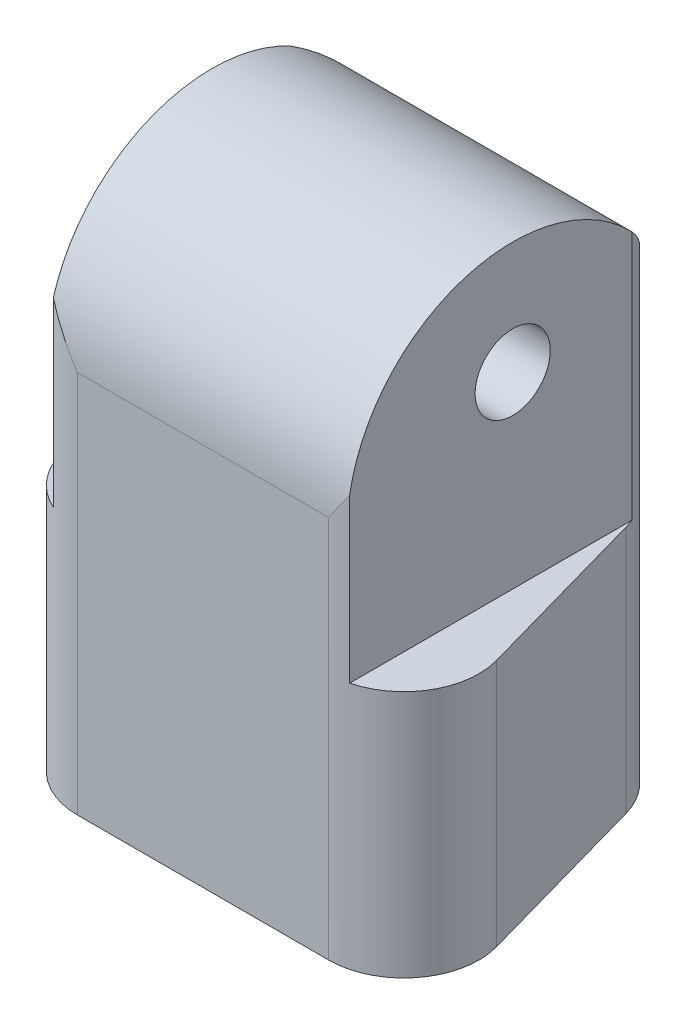
ISO-10303-21;
HEADER;
FILE_DESCRIPTION(('STEP AP214'),'2;1');
FILE_NAME('part.step','',(''),(''),'','','');
FILE_SCHEMA(('AUTOMOTIVE_DESIGN { 1 0 10303 214 1 1 1 1 }'));
ENDSEC;
DATA;
#1=APPLICATION_CONTEXT('core data for automotive mechanical design processes');
#2=APPLICATION_PROTOCOL_DEFINITION('international standard','automotive_design',2000,#1);
#3=PRODUCT_CONTEXT('',#1,'mechanical');
#4=PRODUCT('Part','Part','',(#3));
#5=PRODUCT_RELATED_PRODUCT_CATEGORY('part','',(#4));
#6=PRODUCT_DEFINITION_FORMATION('','',#4);
#7=PRODUCT_DEFINITION_CONTEXT('part definition',#1,'design');
#8=PRODUCT_DEFINITION('design','',#6,#7);
#9=PRODUCT_DEFINITION_SHAPE('','',#8);
#10=(LENGTH_UNIT() NAMED_UNIT(*) SI_UNIT(.MILLI.,.METRE.));
#11=(NAMED_UNIT(*) PLANE_ANGLE_UNIT() SI_UNIT($,.RADIAN.));
#12=(NAMED_UNIT(*) SI_UNIT($,.STERADIAN.) SOLID_ANGLE_UNIT());
#13=UNCERTAINTY_MEASURE_WITH_UNIT(LENGTH_MEASURE(1.E-05),#10,'distance_accuracy_value','');
#14=(GEOMETRIC_REPRESENTATION_CONTEXT(3) GLOBAL_UNCERTAINTY_ASSIGNED_CONTEXT((#13)) GLOBAL_UNIT_ASSIGNED_CONTEXT((#10,
#11,#12)) REPRESENTATION_CONTEXT('',''));
#15=CARTESIAN_POINT('',(0.,0.,0.));
#16=DIRECTION('',(0.,0.,1.));
#17=DIRECTION('',(1.,0.,0.));
#18=AXIS2_PLACEMENT_3D('',#15,#16,#17);
#19=CARTESIAN_POINT('',(-9.79815843344516,15.5,-7.35372788459142));
#20=DIRECTION('',(0.962650940153899,0.,0.270745576918284));
#21=DIRECTION('',(0.270745576918284,0.,-0.962650940153899));
#22=AXIS2_PLACEMENT_3D('',#19,#20,#21);
#23=PLANE('',#22);
#24=DIRECTION('',(0.,1.,0.));
#25=VECTOR('',#24,1.);
#26=CARTESIAN_POINT('',(-10.4,15.5,-5.21384675906311));
#27=LINE('',#26,#25);
#28=CARTESIAN_POINT('',(-10.4,16.5,-5.21384675906311));
#29=VERTEX_POINT('',#28);
#30=CARTESIAN_POINT('',(-10.4,35.1858557687489,-5.2138467590631));
#31=VERTEX_POINT('',#30);
#32=EDGE_CURVE('E204',#29,#31,#27,.T.);
#33=ORIENTED_EDGE('',*,*,#32,.T.);
#34=CARTESIAN_POINT('',(-11.8663944009865,25.5,0.));
#35=DIRECTION('',(0.962650940153899,0.,0.270745576918284));
#36=DIRECTION('',(0.270745576918284,0.,-0.962650940153899));
#37=AXIS2_PLACEMENT_3D('',#34,#35,#36);
#38=ELLIPSE('',#37,11.4267794702838,11.);
#39=CARTESIAN_POINT('',(-9.79815843344516,33.6806287166319,-7.35372788459142));
#40=VERTEX_POINT('',#39);
#41=EDGE_CURVE('E347',#31,#40,#38,.F.);
#42=ORIENTED_EDGE('',*,*,#41,.T.);
#43=DIRECTION('',(0.,-1.,0.));
#44=VECTOR('',#43,1.);
#45=CARTESIAN_POINT('',(-9.79815843344516,15.5,-7.35372788459142));
#46=LINE('',#45,#44);
#47=CARTESIAN_POINT('',(-9.79815843344516,0.,-7.35372788459142));
#48=VERTEX_POINT('',#47);
#49=EDGE_CURVE('E304',#40,#48,#46,.T.);
#50=ORIENTED_EDGE('',*,*,#49,.T.);
#51=DIRECTION('',(-0.270745576918284,0.,0.962650940153899));
#52=VECTOR('',#51,1.);
#53=CARTESIAN_POINT('',(-9.79815843344516,0.,-7.35372788459142));
#54=LINE('',#53,#52);
#55=CARTESIAN_POINT('',(-13.1731584334452,0.,4.64627211540858));
#56=VERTEX_POINT('',#55);
#57=EDGE_CURVE('E305',#48,#56,#54,.T.);
#58=ORIENTED_EDGE('',*,*,#57,.T.);
#59=DIRECTION('',(0.,-1.,0.));
#60=VECTOR('',#59,1.);
#61=CARTESIAN_POINT('',(-13.1731584334452,15.5,4.64627211540858));
#62=LINE('',#61,#60);
#63=CARTESIAN_POINT('',(-13.1731584334452,16.5,4.64627211540858));
#64=VERTEX_POINT('',#63);
#65=EDGE_CURVE('E65',#64,#56,#62,.T.);
#66=ORIENTED_EDGE('',*,*,#65,.F.);
#67=DIRECTION('',(0.270745576918284,0.,-0.962650940153899));
#68=VECTOR('',#67,1.);
#69=CARTESIAN_POINT('',(-9.79815843344516,16.5,-7.35372788459142));
#70=LINE('',#69,#68);
#71=EDGE_CURVE('E317',#64,#29,#70,.T.);
#72=ORIENTED_EDGE('',*,*,#71,.T.);
#73=EDGE_LOOP('',(#33,#42,#50,#58,#66,#72));
#74=FACE_BOUND('',#73,.T.);
#75=ADVANCED_FACE('F40',(#74),#23,.F.);
#76=CARTESIAN_POINT('',(9.6,36.5,-11.));
#77=DIRECTION('',(-1.,0.,0.));
#78=DIRECTION('',(0.,0.,1.));
#79=AXIS2_PLACEMENT_3D('',#76,#77,#78);
#80=PLANE('',#79);
#81=CARTESIAN_POINT('',(9.6,29.,0.));
#82=DIRECTION('',(1.,0.,0.));
#83=DIRECTION('',(0.,1.,0.));
#84=AXIS2_PLACEMENT_3D('',#81,#82,#83);
#85=CIRCLE('',#84,2.5);
#86=CARTESIAN_POINT('',(9.6,31.5,0.));
#87=VERTEX_POINT('',#86);
#88=EDGE_CURVE('E536',#87,#87,#85,.T.);
#89=ORIENTED_EDGE('',*,*,#88,.F.);
#90=EDGE_LOOP('',(#89));
#91=FACE_BOUND('',#90,.T.);
#92=DIRECTION('',(0.,-1.,0.));
#93=VECTOR('',#92,1.);
#94=CARTESIAN_POINT('',(9.6,15.5,-7.9237688123392));
#95=LINE('',#94,#93);
#96=CARTESIAN_POINT('',(9.59999999999999,33.1298026061361,-7.92376881233919));
#97=VERTEX_POINT('',#96);
#98=CARTESIAN_POINT('',(9.6,16.5,-7.9237688123392));
#99=VERTEX_POINT('',#98);
#100=EDGE_CURVE('E197',#97,#99,#95,.T.);
#101=ORIENTED_EDGE('',*,*,#100,.F.);
#102=CARTESIAN_POINT('',(9.6,25.5,0.));
#103=DIRECTION('',(-1.,0.,0.));
#104=DIRECTION('',(0.,1.,0.));
#105=AXIS2_PLACEMENT_3D('',#102,#103,#104);
#106=CIRCLE('',#105,11.);
#107=CARTESIAN_POINT('',(9.6,27.3473041336646,10.8437755158315));
#108=VERTEX_POINT('',#107);
#109=EDGE_CURVE('E182',#108,#97,#106,.T.);
#110=ORIENTED_EDGE('',*,*,#109,.F.);
#111=DIRECTION('',(0.,-1.,0.));
#112=VECTOR('',#111,1.);
#113=CARTESIAN_POINT('',(9.6,15.5,10.8437755158315));
#114=LINE('',#113,#112);
#115=CARTESIAN_POINT('',(9.6,16.5,10.8437755158315));
#116=VERTEX_POINT('',#115);
#117=EDGE_CURVE('E194',#116,#108,#114,.F.);
#118=ORIENTED_EDGE('',*,*,#117,.F.);
#119=DIRECTION('',(0.,0.,1.));
#120=VECTOR('',#119,1.);
#121=CARTESIAN_POINT('',(9.6,16.5,-11.));
#122=LINE('',#121,#120);
#123=EDGE_CURVE('E186',#99,#116,#122,.T.);
#124=ORIENTED_EDGE('',*,*,#123,.F.);
#125=EDGE_LOOP('',(#101,#110,#118,#124));
#126=FACE_BOUND('',#125,.T.);
#127=ADVANCED_FACE('F193',(#91,#126),#80,.F.);
#128=CARTESIAN_POINT('',(-10.4,36.5,-11.));
#129=DIRECTION('',(1.,0.,0.));
#130=DIRECTION('',(0.,1.,0.));
#131=AXIS2_PLACEMENT_3D('',#128,#129,#130);
#132=PLANE('',#131);
#133=CARTESIAN_POINT('',(-10.4,29.,0.));
#134=DIRECTION('',(1.,0.,0.));
#135=DIRECTION('',(0.,1.,0.));
#136=AXIS2_PLACEMENT_3D('',#133,#134,#135);
#137=CIRCLE('',#136,2.5);
#138=CARTESIAN_POINT('',(-10.4,31.5,0.));
#139=VERTEX_POINT('',#138);
#140=EDGE_CURVE('E45',#139,#139,#137,.T.);
#141=ORIENTED_EDGE('',*,*,#140,.T.);
#142=EDGE_LOOP('',(#141));
#143=FACE_BOUND('',#142,.T.);
#144=CARTESIAN_POINT('',(-10.4,25.5,0.));
#145=DIRECTION('',(1.,0.,0.));
#146=DIRECTION('',(0.,1.,0.));
#147=AXIS2_PLACEMENT_3D('',#144,#145,#146);
#148=CIRCLE('',#147,11.);
#149=CARTESIAN_POINT('',(-10.4,28.5632651518185,10.5648666158004));
#150=VERTEX_POINT('',#149);
#151=EDGE_CURVE('E11',#150,#31,#148,.F.);
#152=ORIENTED_EDGE('',*,*,#151,.T.);
#153=ORIENTED_EDGE('',*,*,#32,.F.);
#154=DIRECTION('',(0.,0.,1.));
#155=VECTOR('',#154,1.);
#156=CARTESIAN_POINT('',(-10.4,16.5,-11.));
#157=LINE('',#156,#155);
#158=CARTESIAN_POINT('',(-10.4,16.5,10.5648666158004));
#159=VERTEX_POINT('',#158);
#160=EDGE_CURVE('E207',#29,#159,#157,.T.);
#161=ORIENTED_EDGE('',*,*,#160,.T.);
#162=DIRECTION('',(0.,-1.,0.));
#163=VECTOR('',#162,1.);
#164=CARTESIAN_POINT('',(-10.4,15.5,10.5648666158004));
#165=LINE('',#164,#163);
#166=EDGE_CURVE('E210',#150,#159,#165,.T.);
#167=ORIENTED_EDGE('',*,*,#166,.F.);
#168=EDGE_LOOP('',(#152,#153,#161,#167));
#169=FACE_BOUND('',#168,.T.);
#170=ADVANCED_FACE('F406',(#143,#169),#132,.F.);
#171=CARTESIAN_POINT('',(-8.35990373267567,0.,6.));
#172=DIRECTION('',(0.,-1.,0.));
#173=DIRECTION('',(0.,0.,-1.));
#174=AXIS2_PLACEMENT_3D('',#171,#172,#173);
#175=PLANE('',#174);
#176=CARTESIAN_POINT('',(-8.35990373267567,0.,6.));
#177=DIRECTION('',(0.,1.,0.));
#178=DIRECTION('',(0.,0.,-1.));
#179=AXIS2_PLACEMENT_3D('',#176,#177,#178);
#180=CIRCLE('',#179,5.);
#181=CARTESIAN_POINT('',(-8.35990373267567,0.,11.));
#182=VERTEX_POINT('',#181);
#183=EDGE_CURVE('E285',#56,#182,#180,.T.);
#184=ORIENTED_EDGE('',*,*,#183,.F.);
#185=ORIENTED_EDGE('',*,*,#57,.F.);
#186=CARTESIAN_POINT('',(-4.98490373267567,0.,-6.));
#187=DIRECTION('',(0.,1.,0.));
#188=DIRECTION('',(0.,0.,1.));
#189=AXIS2_PLACEMENT_3D('',#186,#187,#188);
#190=CIRCLE('',#189,5.);
#191=CARTESIAN_POINT('',(-4.98490373267567,0.,-11.));
#192=VERTEX_POINT('',#191);
#193=EDGE_CURVE('E297',#192,#48,#190,.T.);
#194=ORIENTED_EDGE('',*,*,#193,.F.);
#195=DIRECTION('',(-1.,0.,0.));
#196=VECTOR('',#195,1.);
#197=CARTESIAN_POINT('',(-4.98490373267567,0.,-11.));
#198=LINE('',#197,#196);
#199=CARTESIAN_POINT('',(4.98490373267567,0.,-11.));
#200=VERTEX_POINT('',#199);
#201=EDGE_CURVE('E298',#200,#192,#198,.T.);
#202=ORIENTED_EDGE('',*,*,#201,.F.);
#203=CARTESIAN_POINT('',(4.98490373267567,0.,-6.));
#204=DIRECTION('',(0.,1.,0.));
#205=DIRECTION('',(0.,0.,-1.));
#206=AXIS2_PLACEMENT_3D('',#203,#204,#205);
#207=CIRCLE('',#206,5.);
#208=CARTESIAN_POINT('',(9.79815843344516,0.,-7.35372788459142));
#209=VERTEX_POINT('',#208);
#210=EDGE_CURVE('E291',#209,#200,#207,.T.);
#211=ORIENTED_EDGE('',*,*,#210,.F.);
#212=DIRECTION('',(-0.270745576918284,0.,-0.962650940153899));
#213=VECTOR('',#212,1.);
#214=CARTESIAN_POINT('',(9.79815843344516,0.,-7.35372788459142));
#215=LINE('',#214,#213);
#216=CARTESIAN_POINT('',(13.1731584334452,0.,4.64627211540858));
#217=VERTEX_POINT('',#216);
#218=EDGE_CURVE('E289',#217,#209,#215,.T.);
#219=ORIENTED_EDGE('',*,*,#218,.F.);
#220=CARTESIAN_POINT('',(8.35990373267567,0.,6.));
#221=DIRECTION('',(0.,1.,0.));
#222=DIRECTION('',(0.,0.,1.));
#223=AXIS2_PLACEMENT_3D('',#220,#221,#222);
#224=CIRCLE('',#223,5.);
#225=CARTESIAN_POINT('',(8.35990373267567,0.,11.));
#226=VERTEX_POINT('',#225);
#227=EDGE_CURVE('E290',#226,#217,#224,.T.);
#228=ORIENTED_EDGE('',*,*,#227,.F.);
#229=DIRECTION('',(1.,0.,0.));
#230=VECTOR('',#229,1.);
#231=CARTESIAN_POINT('',(-8.35990373267567,0.,11.));
#232=LINE('',#231,#230);
#233=EDGE_CURVE('E282',#182,#226,#232,.T.);
#234=ORIENTED_EDGE('',*,*,#233,.F.);
#235=EDGE_LOOP('',(#184,#185,#194,#202,#211,#219,#228,#234));
#236=FACE_BOUND('',#235,.T.);
#237=DIRECTION('',(1.,0.,0.));
#238=VECTOR('',#237,1.);
#239=CARTESIAN_POINT('',(-8.35990373267567,0.,8.));
#240=LINE('',#239,#238);
#241=CARTESIAN_POINT('',(-8.35990373267567,0.,8.));
#242=VERTEX_POINT('',#241);
#243=CARTESIAN_POINT('',(8.35990373267567,0.,8.));
#244=VERTEX_POINT('',#243);
#245=EDGE_CURVE('E221',#242,#244,#240,.T.);
#246=ORIENTED_EDGE('',*,*,#245,.T.);
#247=CARTESIAN_POINT('',(8.35990373267567,0.,6.));
#248=DIRECTION('',(0.,1.,0.));
#249=DIRECTION('',(0.,0.,1.));
#250=AXIS2_PLACEMENT_3D('',#247,#248,#249);
#251=CIRCLE('',#250,2.);
#252=CARTESIAN_POINT('',(10.2852056129835,0.,5.45850884616343));
#253=VERTEX_POINT('',#252);
#254=EDGE_CURVE('E53',#244,#253,#251,.T.);
#255=ORIENTED_EDGE('',*,*,#254,.T.);
#256=DIRECTION('',(-0.270745576918284,0.,-0.962650940153899));
#257=VECTOR('',#256,1.);
#258=CARTESIAN_POINT('',(6.91020561298346,0.,-6.54149115383657));
#259=LINE('',#258,#257);
#260=CARTESIAN_POINT('',(6.91020561298346,0.,-6.54149115383657));
#261=VERTEX_POINT('',#260);
#262=EDGE_CURVE('E250',#253,#261,#259,.T.);
#263=ORIENTED_EDGE('',*,*,#262,.T.);
#264=CARTESIAN_POINT('',(4.98490373267567,0.,-6.));
#265=DIRECTION('',(0.,1.,0.));
#266=DIRECTION('',(0.,0.,-1.));
#267=AXIS2_PLACEMENT_3D('',#264,#265,#266);
#268=CIRCLE('',#267,2.);
#269=CARTESIAN_POINT('',(4.98490373267567,0.,-8.));
#270=VERTEX_POINT('',#269);
#271=EDGE_CURVE('E249',#261,#270,#268,.T.);
#272=ORIENTED_EDGE('',*,*,#271,.T.);
#273=DIRECTION('',(-1.,0.,0.));
#274=VECTOR('',#273,1.);
#275=CARTESIAN_POINT('',(-4.98490373267567,0.,-8.));
#276=LINE('',#275,#274);
#277=CARTESIAN_POINT('',(-4.98490373267567,0.,-8.));
#278=VERTEX_POINT('',#277);
#279=EDGE_CURVE('E251',#270,#278,#276,.T.);
#280=ORIENTED_EDGE('',*,*,#279,.T.);
#281=CARTESIAN_POINT('',(-4.98490373267567,0.,-6.));
#282=DIRECTION('',(0.,1.,0.));
#283=DIRECTION('',(0.,0.,1.));
#284=AXIS2_PLACEMENT_3D('',#281,#282,#283);
#285=CIRCLE('',#284,2.);
#286=CARTESIAN_POINT('',(-6.91020561298346,0.,-6.54149115383657));
#287=VERTEX_POINT('',#286);
#288=EDGE_CURVE('E258',#278,#287,#285,.T.);
#289=ORIENTED_EDGE('',*,*,#288,.T.);
#290=DIRECTION('',(-0.270745576918284,0.,0.962650940153899));
#291=VECTOR('',#290,1.);
#292=CARTESIAN_POINT('',(-6.91020561298346,0.,-6.54149115383657));
#293=LINE('',#292,#291);
#294=CARTESIAN_POINT('',(-10.2852056129835,0.,5.45850884616343));
#295=VERTEX_POINT('',#294);
#296=EDGE_CURVE('E259',#287,#295,#293,.T.);
#297=ORIENTED_EDGE('',*,*,#296,.T.);
#298=CARTESIAN_POINT('',(-8.35990373267567,0.,6.));
#299=DIRECTION('',(0.,1.,0.));
#300=DIRECTION('',(0.,0.,-1.));
#301=AXIS2_PLACEMENT_3D('',#298,#299,#300);
#302=CIRCLE('',#301,2.);
#303=EDGE_CURVE('E265',#295,#242,#302,.T.);
#304=ORIENTED_EDGE('',*,*,#303,.T.);
#305=EDGE_LOOP('',(#246,#255,#263,#272,#280,#289,#297,#304));
#306=FACE_BOUND('',#305,.T.);
#307=ADVANCED_FACE('F340',(#236,#306),#175,.T.);
#308=CARTESIAN_POINT('',(-8.35990373267567,15.5,6.));
#309=DIRECTION('',(0.,-1.,0.));
#310=DIRECTION('',(0.,0.,-1.));
#311=AXIS2_PLACEMENT_3D('',#308,#309,#310);
#312=CYLINDRICAL_SURFACE('',#311,5.);
#313=DIRECTION('',(0.,-1.,0.));
#314=VECTOR('',#313,1.);
#315=CARTESIAN_POINT('',(-8.35990373267567,15.5,11.));
#316=LINE('',#315,#314);
#317=CARTESIAN_POINT('',(-8.35990373267567,25.5,11.));
#318=VERTEX_POINT('',#317);
#319=EDGE_CURVE('E320',#318,#182,#316,.T.);
#320=ORIENTED_EDGE('',*,*,#319,.F.);
#321=CARTESIAN_POINT('',(-13.1731584334452,35.4705644488954,4.64627211540859));
#322=CARTESIAN_POINT('',(-13.2137526136205,35.4033887180737,4.79052052757966));
#323=CARTESIAN_POINT('',(-13.2473195843112,35.3322910550403,4.93482666204207));
#324=CARTESIAN_POINT('',(-13.301139720721,35.182846921723,5.22191447166556));
#325=CARTESIAN_POINT('',(-13.3214113283337,35.104510664964,5.36469798705871));
#326=CARTESIAN_POINT('',(-13.3493542044912,34.9417849006704,5.64614332311464));
#327=CARTESIAN_POINT('',(-13.3571453326786,34.8574611973818,5.78483163899371));
#328=CARTESIAN_POINT('',(-13.3614347513838,34.6826462180126,6.05849631500323));
#329=CARTESIAN_POINT('',(-13.3579281792005,34.5921523025864,6.19347105153847));
#330=CARTESIAN_POINT('',(-13.3385452082702,34.3837036131109,6.48998463356343));
#331=CARTESIAN_POINT('',(-13.3199584261093,34.2642890287763,6.65032194321576));
#332=CARTESIAN_POINT('',(-13.2688560411909,34.0180246899955,6.96296687992261));
#333=CARTESIAN_POINT('',(-13.2363307372706,33.8911698103052,7.1152688313239));
#334=CARTESIAN_POINT('',(-13.1589525407084,33.6306187094603,7.41162019075928));
#335=CARTESIAN_POINT('',(-13.1140539032647,33.4968986299768,7.55563653043223));
#336=CARTESIAN_POINT('',(-13.0136132063968,33.2240285316944,7.83437481364479));
#337=CARTESIAN_POINT('',(-12.9580740810914,33.0848800181927,7.96909930551918));
#338=CARTESIAN_POINT('',(-12.813534625673,32.744872770913,8.28157497190547));
#339=CARTESIAN_POINT('',(-12.7200677849021,32.5417362050373,8.45479528779996));
#340=CARTESIAN_POINT('',(-12.518374589807,32.1280776786333,8.78284342608961));
#341=CARTESIAN_POINT('',(-12.4101426603901,31.9175529508467,8.93766425957891));
#342=CARTESIAN_POINT('',(-12.1815705893507,31.4903697428599,9.22943387169951));
#343=CARTESIAN_POINT('',(-12.0612157483371,31.2737040508588,9.36636047966135));
#344=CARTESIAN_POINT('',(-11.8108105051792,30.8356992826507,9.62261415231035));
#345=CARTESIAN_POINT('',(-11.6807602002114,30.6143602532999,9.7419413933581));
#346=CARTESIAN_POINT('',(-11.3594220421876,30.0789191741822,10.0077474655112));
#347=CARTESIAN_POINT('',(-11.1643874880406,29.7630084414652,10.1460900734231));
#348=CARTESIAN_POINT('',(-10.7631816117048,29.1258696848297,10.3908425593312));
#349=CARTESIAN_POINT('',(-10.5570053860218,28.8046393635897,10.4972382400586));
#350=CARTESIAN_POINT('',(-10.1371659450634,28.1589529487912,10.6790590508571));
#351=CARTESIAN_POINT('',(-9.9235121276392,27.8345012471477,10.7545216407665));
#352=CARTESIAN_POINT('',(-9.49138821118636,27.1834653944775,10.8754562617424));
#353=CARTESIAN_POINT('',(-9.27291984928655,26.8568820415606,10.9209389324972));
#354=CARTESIAN_POINT('',(-8.82687000482515,26.1926439828227,10.9833880124945));
#355=CARTESIAN_POINT('',(-8.59921244005542,25.8549525292811,10.9994526524905));
#356=CARTESIAN_POINT('',(-8.36772106582655,25.5115949793659,10.9999954144569));
#357=CARTESIAN_POINT('',(-8.36381238467636,25.5057974683494,10.9999999976373));
#358=CARTESIAN_POINT('',(-8.35990373267567,25.5,11.));
#359=B_SPLINE_CURVE_WITH_KNOTS('',3,(#321,#322,#323,#324,#325,#326,#327,#328,#329,#330,#331,
#332,#333,#334,#335,#336,#337,#338,#339,#340,#341,#342,#343,#344,#345,#346,#347,#348,#349,#350,
#351,#352,#353,#354,#355,#356,#357,#358),.UNSPECIFIED.,.F.,.F.,(4,2,2,2,2,2,2,2,2,2,2,2,2,2,2,2,
2,2,4),(0.,0.492345144815961,0.984005909050386,1.47091594062857,1.95803557364614,
2.5594976950439,3.16137911360177,3.76551627904864,4.36948709258799,5.21676729834044,
6.06436831542592,6.91300973698005,7.76164265384873,8.94853941607623,10.1359628592407,
11.3219440591264,12.5075041346641,13.72883384695,13.74981002842),.UNSPECIFIED.);
#360=EDGE_CURVE('E357',#318,#150,#359,.F.);
#361=ORIENTED_EDGE('',*,*,#360,.T.);
#362=ORIENTED_EDGE('',*,*,#166,.T.);
#363=CARTESIAN_POINT('',(-8.35990373267567,16.5,6.));
#364=DIRECTION('',(0.,-1.,0.));
#365=DIRECTION('',(0.,0.,-1.));
#366=AXIS2_PLACEMENT_3D('',#363,#364,#365);
#367=CIRCLE('',#366,5.);
#368=EDGE_CURVE('E212',#159,#64,#367,.T.);
#369=ORIENTED_EDGE('',*,*,#368,.T.);
#370=ORIENTED_EDGE('',*,*,#65,.T.);
#371=ORIENTED_EDGE('',*,*,#183,.T.);
#372=EDGE_LOOP('',(#320,#361,#362,#369,#370,#371));
#373=FACE_BOUND('',#372,.T.);
#374=ADVANCED_FACE('F39',(#373),#312,.T.);
#375=CARTESIAN_POINT('',(-8.35990373267567,15.5,11.));
#376=DIRECTION('',(0.,0.,-1.));
#377=DIRECTION('',(-1.,0.,0.));
#378=AXIS2_PLACEMENT_3D('',#375,#376,#377);
#379=PLANE('',#378);
#380=DIRECTION('',(0.,-1.,0.));
#381=VECTOR('',#380,1.);
#382=CARTESIAN_POINT('',(8.35990373267567,15.5,11.));
#383=LINE('',#382,#381);
#384=CARTESIAN_POINT('',(8.35990373267567,25.5,11.));
#385=VERTEX_POINT('',#384);
#386=EDGE_CURVE('E312',#385,#226,#383,.T.);
#387=ORIENTED_EDGE('',*,*,#386,.F.);
#388=DIRECTION('',(1.,0.,0.));
#389=VECTOR('',#388,1.);
#390=CARTESIAN_POINT('',(-13.3599037326757,25.5,11.));
#391=LINE('',#390,#389);
#392=EDGE_CURVE('E184',#318,#385,#391,.T.);
#393=ORIENTED_EDGE('',*,*,#392,.F.);
#394=ORIENTED_EDGE('',*,*,#319,.T.);
#395=ORIENTED_EDGE('',*,*,#233,.T.);
#396=EDGE_LOOP('',(#387,#393,#394,#395));
#397=FACE_BOUND('',#396,.T.);
#398=ADVANCED_FACE('F396',(#397),#379,.F.);
#399=CARTESIAN_POINT('',(8.35990373267567,15.5,6.));
#400=DIRECTION('',(0.,-1.,0.));
#401=DIRECTION('',(0.,0.,-1.));
#402=AXIS2_PLACEMENT_3D('',#399,#400,#401);
#403=CYLINDRICAL_SURFACE('',#402,5.);
#404=ORIENTED_EDGE('',*,*,#117,.T.);
#405=CARTESIAN_POINT('',(9.6,27.3473041336646,10.8437755158315));
#406=CARTESIAN_POINT('',(9.39763077500791,27.0431919318889,10.8955501873901));
#407=CARTESIAN_POINT('',(9.19327942021365,26.7381039547224,10.9343929838711));
#408=CARTESIAN_POINT('',(8.78314319474962,26.1277791525181,10.9863387541738));
#409=CARTESIAN_POINT('',(8.57736301491017,25.8225444911736,10.9995040539027));
#410=CARTESIAN_POINT('',(8.36772107104189,25.5115949883734,10.9999954111663));
#411=CARTESIAN_POINT('',(8.36381238993019,25.5057974774569,10.9999999942913));
#412=CARTESIAN_POINT('',(8.35990373267567,25.5,11.));
#413=B_SPLINE_CURVE_WITH_KNOTS('',3,(#405,#406,#407,#408,#409,#410,#411,#412),.UNSPECIFIED.,.F.,
.F.,(4,2,2,4),(0.,1.10676530083787,2.21084083707872,2.23181701854905),.UNSPECIFIED.);
#414=EDGE_CURVE('E178',#108,#385,#413,.T.);
#415=ORIENTED_EDGE('',*,*,#414,.T.);
#416=ORIENTED_EDGE('',*,*,#386,.T.);
#417=ORIENTED_EDGE('',*,*,#227,.T.);
#418=DIRECTION('',(0.,-1.,0.));
#419=VECTOR('',#418,1.);
#420=CARTESIAN_POINT('',(13.1731584334452,15.5,4.64627211540858));
#421=LINE('',#420,#419);
#422=CARTESIAN_POINT('',(13.1731584334452,16.5,4.64627211540858));
#423=VERTEX_POINT('',#422);
#424=EDGE_CURVE('E311',#423,#217,#421,.T.);
#425=ORIENTED_EDGE('',*,*,#424,.F.);
#426=CARTESIAN_POINT('',(8.35990373267567,16.5,6.));
#427=DIRECTION('',(0.,-1.,0.));
#428=DIRECTION('',(0.,0.,-1.));
#429=AXIS2_PLACEMENT_3D('',#426,#427,#428);
#430=CIRCLE('',#429,5.);
#431=EDGE_CURVE('E201',#423,#116,#430,.T.);
#432=ORIENTED_EDGE('',*,*,#431,.T.);
#433=EDGE_LOOP('',(#404,#415,#416,#417,#425,#432));
#434=FACE_BOUND('',#433,.T.);
#435=ADVANCED_FACE('F203',(#434),#403,.T.);
#436=CARTESIAN_POINT('',(9.79815843344516,15.5,-7.35372788459142));
#437=DIRECTION('',(-0.962650940153899,0.,0.270745576918284));
#438=DIRECTION('',(0.270745576918284,0.,0.962650940153899));
#439=AXIS2_PLACEMENT_3D('',#436,#437,#438);
#440=PLANE('',#439);
#441=DIRECTION('',(0.,-1.,0.));
#442=VECTOR('',#441,1.);
#443=CARTESIAN_POINT('',(9.79815843344516,15.5,-7.35372788459142));
#444=LINE('',#443,#442);
#445=CARTESIAN_POINT('',(9.79815843344516,16.5,-7.35372788459142));
#446=VERTEX_POINT('',#445);
#447=EDGE_CURVE('E313',#446,#209,#444,.T.);
#448=ORIENTED_EDGE('',*,*,#447,.F.);
#449=DIRECTION('',(0.270745576918284,0.,0.962650940153899));
#450=VECTOR('',#449,1.);
#451=CARTESIAN_POINT('',(9.79815843344516,16.5,-7.35372788459142));
#452=LINE('',#451,#450);
#453=EDGE_CURVE('E216',#446,#423,#452,.T.);
#454=ORIENTED_EDGE('',*,*,#453,.T.);
#455=ORIENTED_EDGE('',*,*,#424,.T.);
#456=ORIENTED_EDGE('',*,*,#218,.T.);
#457=EDGE_LOOP('',(#448,#454,#455,#456));
#458=FACE_BOUND('',#457,.T.);
#459=ADVANCED_FACE('F329',(#458),#440,.F.);
#460=CARTESIAN_POINT('',(4.98490373267567,15.5,-6.));
#461=DIRECTION('',(0.,-1.,0.));
#462=DIRECTION('',(0.,0.,-1.));
#463=AXIS2_PLACEMENT_3D('',#460,#461,#462);
#464=CYLINDRICAL_SURFACE('',#463,5.);
#465=DIRECTION('',(0.,-1.,0.));
#466=VECTOR('',#465,1.);
#467=CARTESIAN_POINT('',(4.98490373267567,15.5,-11.));
#468=LINE('',#467,#466);
#469=CARTESIAN_POINT('',(4.98490373267566,25.5,-11.));
#470=VERTEX_POINT('',#469);
#471=EDGE_CURVE('E310',#470,#200,#468,.T.);
#472=ORIENTED_EDGE('',*,*,#471,.F.);
#473=CARTESIAN_POINT('',(9.6,33.1298026061361,-7.92376881233921));
#474=CARTESIAN_POINT('',(9.56163664547099,33.0342353420458,-8.01579032156864));
#475=CARTESIAN_POINT('',(9.52097540059832,32.9375063776603,-8.10559890241608));
#476=CARTESIAN_POINT('',(9.43547048312103,32.7419537246069,-8.2807811464618));
#477=CARTESIAN_POINT('',(9.3906279540968,32.6431306143679,-8.36615601239244));
#478=CARTESIAN_POINT('',(9.25058998000552,32.3441578836269,-8.61537798100406));
#479=CARTESIAN_POINT('',(9.14973728175341,32.1411450508679,-8.77266729742245));
#480=CARTESIAN_POINT('',(8.93630659115331,31.7301380800129,-9.06913955858534));
#481=CARTESIAN_POINT('',(8.82379039612555,31.52217428179,-9.20840994555284));
#482=CARTESIAN_POINT('',(8.58877746407678,31.1013093608714,-9.47031131793883));
#483=CARTESIAN_POINT('',(8.46627481569765,30.8884053680104,-9.59293233181464));
#484=CARTESIAN_POINT('',(8.16200438008178,30.3717763851636,-9.86826959305264));
#485=CARTESIAN_POINT('',(7.97630646578134,30.066147065219,-10.0130983232039));
#486=CARTESIAN_POINT('',(7.59317319850534,29.4492968816608,-10.2720493078067));
#487=CARTESIAN_POINT('',(7.39573435660491,29.1380743753451,-10.3861623785828));
#488=CARTESIAN_POINT('',(6.99211232451012,28.5111569238296,-10.5849540303161));
#489=CARTESIAN_POINT('',(6.78591451641489,28.1954551386329,-10.6695810479187));
#490=CARTESIAN_POINT('',(6.36794738016058,27.5615494094433,-10.8099652172124));
#491=CARTESIAN_POINT('',(6.15618048954272,27.2433466015188,-10.8657347856396));
#492=CARTESIAN_POINT('',(5.78617593286631,26.6903018661798,-10.9379580740207));
#493=CARTESIAN_POINT('',(5.62867425909154,26.4557876071784,-10.9609223057748));
#494=CARTESIAN_POINT('',(5.31298340299656,25.9866315483296,-10.991741020609));
#495=CARTESIAN_POINT('',(5.15479539899154,25.7519903230006,-10.9996153590486));
#496=CARTESIAN_POINT('',(4.99272107423661,25.5115949916079,-10.9999954156931));
#497=CARTESIAN_POINT('',(4.98881239308534,25.505797480571,-10.9999999989226));
#498=CARTESIAN_POINT('',(4.98490373267567,25.5,-11.));
#499=B_SPLINE_CURVE_WITH_KNOTS('',3,(#473,#474,#475,#476,#477,#478,#479,#480,#481,#482,#483,
#484,#485,#486,#487,#488,#489,#490,#491,#492,#493,#494,#495,#496,#497,#498),.UNSPECIFIED.,.F.,
.F.,(4,2,2,2,2,2,2,2,2,2,2,2,4),(0.,0.414216272896473,0.828319588170614,1.65497331820399,
2.47745163029459,3.30042038359185,4.45625329874184,5.61243141348679,6.77062134999481,
7.92831252716347,8.77823439087447,9.62703715306524,9.64801333453525),.UNSPECIFIED.);
#500=EDGE_CURVE('E187',#470,#97,#499,.F.);
#501=ORIENTED_EDGE('',*,*,#500,.T.);
#502=ORIENTED_EDGE('',*,*,#100,.T.);
#503=CARTESIAN_POINT('',(4.98490373267567,16.5,-6.));
#504=DIRECTION('',(0.,-1.,0.));
#505=DIRECTION('',(0.,0.,-1.));
#506=AXIS2_PLACEMENT_3D('',#503,#504,#505);
#507=CIRCLE('',#506,5.);
#508=EDGE_CURVE('E50',#99,#446,#507,.T.);
#509=ORIENTED_EDGE('',*,*,#508,.T.);
#510=ORIENTED_EDGE('',*,*,#447,.T.);
#511=ORIENTED_EDGE('',*,*,#210,.T.);
#512=EDGE_LOOP('',(#472,#501,#502,#509,#510,#511));
#513=FACE_BOUND('',#512,.T.);
#514=ADVANCED_FACE('F330',(#513),#464,.T.);
#515=CARTESIAN_POINT('',(-4.98490373267567,15.5,-11.));
#516=DIRECTION('',(0.,0.,1.));
#517=DIRECTION('',(1.,0.,0.));
#518=AXIS2_PLACEMENT_3D('',#515,#516,#517);
#519=PLANE('',#518);
#520=DIRECTION('',(0.,-1.,0.));
#521=VECTOR('',#520,1.);
#522=CARTESIAN_POINT('',(-4.98490373267567,15.5,-11.));
#523=LINE('',#522,#521);
#524=CARTESIAN_POINT('',(-4.98490373267567,25.5,-11.));
#525=VERTEX_POINT('',#524);
#526=EDGE_CURVE('E307',#525,#192,#523,.T.);
#527=ORIENTED_EDGE('',*,*,#526,.F.);
#528=DIRECTION('',(1.,0.,0.));
#529=VECTOR('',#528,1.);
#530=CARTESIAN_POINT('',(-13.3599037326757,25.5,-11.));
#531=LINE('',#530,#529);
#532=EDGE_CURVE('E196',#525,#470,#531,.T.);
#533=ORIENTED_EDGE('',*,*,#532,.T.);
#534=ORIENTED_EDGE('',*,*,#471,.T.);
#535=ORIENTED_EDGE('',*,*,#201,.T.);
#536=EDGE_LOOP('',(#527,#533,#534,#535));
#537=FACE_BOUND('',#536,.T.);
#538=ADVANCED_FACE('F343',(#537),#519,.F.);
#539=CARTESIAN_POINT('',(-4.98490373267567,15.5,-6.));
#540=DIRECTION('',(0.,-1.,0.));
#541=DIRECTION('',(0.,0.,-1.));
#542=AXIS2_PLACEMENT_3D('',#539,#540,#541);
#543=CYLINDRICAL_SURFACE('',#542,5.);
#544=ORIENTED_EDGE('',*,*,#49,.F.);
#545=CARTESIAN_POINT('',(-9.79815843344516,33.6806287166319,-7.35372788459142));
#546=CARTESIAN_POINT('',(-9.75465537166524,33.5416857982638,-7.50831075518314));
#547=CARTESIAN_POINT('',(-9.70459681075226,33.3993472200002,-7.65782791240316));
#548=CARTESIAN_POINT('',(-9.59310904616897,33.1089960012506,-7.94637955837548));
#549=CARTESIAN_POINT('',(-9.53169472409463,32.9609909855658,-8.08542743521919));
#550=CARTESIAN_POINT('',(-9.39951817957721,32.6609753825683,-8.35227619683873));
#551=CARTESIAN_POINT('',(-9.32881525389946,32.5089947303776,-8.4801405042173));
#552=CARTESIAN_POINT('',(-9.17910942759891,32.2008478215979,-8.72567877916722));
#553=CARTESIAN_POINT('',(-9.10010244632504,32.0446795355283,-8.84334768436837));
#554=CARTESIAN_POINT('',(-8.88624715152016,31.6355588733103,-9.1351025192689));
#555=CARTESIAN_POINT('',(-8.74597301968927,31.3799087378952,-9.30147374999722));
#556=CARTESIAN_POINT('',(-8.45148745603877,30.8618220787071,-9.60946193009289));
#557=CARTESIAN_POINT('',(-8.29727063300882,30.5993829580841,-9.75106924137581));
#558=CARTESIAN_POINT('',(-7.97735361097081,30.0681773708778,-10.0109721230603));
#559=CARTESIAN_POINT('',(-7.81160533065152,29.7993879310695,-10.1291610689959));
#560=CARTESIAN_POINT('',(-7.47185914451374,29.257952819976,-10.3422643826111));
#561=CARTESIAN_POINT('',(-7.29786253702052,28.9853077602931,-10.4371823988229));
#562=CARTESIAN_POINT('',(-6.95078140879116,28.4480670705796,-10.6011592874501));
#563=CARTESIAN_POINT('',(-6.77793737673775,28.1835841915914,-10.6710986553213));
#564=CARTESIAN_POINT('',(-6.4282298692037,27.6527805274282,-10.7907180504656));
#565=CARTESIAN_POINT('',(-6.2513660070418,27.3864595671723,-10.8403961199525));
#566=CARTESIAN_POINT('',(-5.71780490103298,26.5870950307012,-10.9593711484885));
#567=CARTESIAN_POINT('',(-5.35697976269233,26.0518782250621,-10.9991415006058));
#568=CARTESIAN_POINT('',(-4.9927210318062,25.5115949318782,-10.9999954130336));
#569=CARTESIAN_POINT('',(-4.98881235046523,25.5057974206086,-10.9999999961447));
#570=CARTESIAN_POINT('',(-4.98490373267567,25.5,-11.));
#571=B_SPLINE_CURVE_WITH_KNOTS('',3,(#545,#546,#547,#548,#549,#550,#551,#552,#553,#554,#555,
#556,#557,#558,#559,#560,#561,#562,#563,#564,#565,#566,#567,#568,#569,#570),.UNSPECIFIED.,.F.,
.F.,(4,2,2,2,2,2,2,2,2,2,2,2,4),(0.,0.636690201671431,1.27255186674158,1.90453544657732,
2.53683105103109,3.54248918229519,4.54853784747133,5.55906682904203,6.56943727338182,
7.53950354863585,8.50966353617154,10.443476525853,10.464452707323),.UNSPECIFIED.);
#572=EDGE_CURVE('E353',#40,#525,#571,.T.);
#573=ORIENTED_EDGE('',*,*,#572,.T.);
#574=ORIENTED_EDGE('',*,*,#526,.T.);
#575=ORIENTED_EDGE('',*,*,#193,.T.);
#576=EDGE_LOOP('',(#544,#573,#574,#575));
#577=FACE_BOUND('',#576,.T.);
#578=ADVANCED_FACE('F364',(#577),#543,.T.);
#579=CARTESIAN_POINT('',(8.35990373267567,15.5,6.));
#580=DIRECTION('',(0.,-1.,0.));
#581=DIRECTION('',(0.,0.,-1.));
#582=AXIS2_PLACEMENT_3D('',#579,#580,#581);
#583=CYLINDRICAL_SURFACE('',#582,2.);
#584=ORIENTED_EDGE('',*,*,#254,.F.);
#585=DIRECTION('',(0.,-1.,0.));
#586=VECTOR('',#585,1.);
#587=CARTESIAN_POINT('',(8.35990373267567,15.5,8.));
#588=LINE('',#587,#586);
#589=CARTESIAN_POINT('',(8.35990373267567,15.5,8.));
#590=VERTEX_POINT('',#589);
#591=EDGE_CURVE('E244',#590,#244,#588,.T.);
#592=ORIENTED_EDGE('',*,*,#591,.F.);
#593=CARTESIAN_POINT('',(8.35990373267567,15.5,6.));
#594=DIRECTION('',(0.,1.,0.));
#595=DIRECTION('',(0.,0.,1.));
#596=AXIS2_PLACEMENT_3D('',#593,#594,#595);
#597=CIRCLE('',#596,2.);
#598=CARTESIAN_POINT('',(10.2852056129835,15.5,5.45850884616343));
#599=VERTEX_POINT('',#598);
#600=EDGE_CURVE('E219',#590,#599,#597,.T.);
#601=ORIENTED_EDGE('',*,*,#600,.T.);
#602=DIRECTION('',(0.,-1.,0.));
#603=VECTOR('',#602,1.);
#604=CARTESIAN_POINT('',(10.2852056129835,15.5,5.45850884616343));
#605=LINE('',#604,#603);
#606=EDGE_CURVE('E278',#599,#253,#605,.T.);
#607=ORIENTED_EDGE('',*,*,#606,.T.);
#608=EDGE_LOOP('',(#584,#592,#601,#607));
#609=FACE_BOUND('',#608,.T.);
#610=ADVANCED_FACE('F412',(#609),#583,.F.);
#611=CARTESIAN_POINT('',(6.91020561298346,15.5,-6.54149115383657));
#612=DIRECTION('',(-0.962650940153899,0.,0.270745576918284));
#613=DIRECTION('',(0.270745576918284,0.,0.962650940153899));
#614=AXIS2_PLACEMENT_3D('',#611,#612,#613);
#615=PLANE('',#614);
#616=ORIENTED_EDGE('',*,*,#262,.F.);
#617=ORIENTED_EDGE('',*,*,#606,.F.);
#618=DIRECTION('',(-0.270745576918284,0.,-0.962650940153899));
#619=VECTOR('',#618,1.);
#620=CARTESIAN_POINT('',(6.91020561298346,15.5,-6.54149115383657));
#621=LINE('',#620,#619);
#622=CARTESIAN_POINT('',(6.91020561298346,15.5,-6.54149115383657));
#623=VERTEX_POINT('',#622);
#624=EDGE_CURVE('E224',#599,#623,#621,.T.);
#625=ORIENTED_EDGE('',*,*,#624,.T.);
#626=DIRECTION('',(0.,-1.,0.));
#627=VECTOR('',#626,1.);
#628=CARTESIAN_POINT('',(6.91020561298346,15.5,-6.54149115383657));
#629=LINE('',#628,#627);
#630=EDGE_CURVE('E279',#623,#261,#629,.T.);
#631=ORIENTED_EDGE('',*,*,#630,.T.);
#632=EDGE_LOOP('',(#616,#617,#625,#631));
#633=FACE_BOUND('',#632,.T.);
#634=ADVANCED_FACE('F417',(#633),#615,.T.);
#635=CARTESIAN_POINT('',(4.98490373267567,15.5,-6.));
#636=DIRECTION('',(0.,-1.,0.));
#637=DIRECTION('',(0.,0.,-1.));
#638=AXIS2_PLACEMENT_3D('',#635,#636,#637);
#639=CYLINDRICAL_SURFACE('',#638,2.);
#640=ORIENTED_EDGE('',*,*,#271,.F.);
#641=ORIENTED_EDGE('',*,*,#630,.F.);
#642=CARTESIAN_POINT('',(4.98490373267567,15.5,-6.));
#643=DIRECTION('',(0.,1.,0.));
#644=DIRECTION('',(0.,0.,-1.));
#645=AXIS2_PLACEMENT_3D('',#642,#643,#644);
#646=CIRCLE('',#645,2.);
#647=CARTESIAN_POINT('',(4.98490373267567,15.5,-8.));
#648=VERTEX_POINT('',#647);
#649=EDGE_CURVE('E230',#623,#648,#646,.T.);
#650=ORIENTED_EDGE('',*,*,#649,.T.);
#651=DIRECTION('',(0.,-1.,0.));
#652=VECTOR('',#651,1.);
#653=CARTESIAN_POINT('',(4.98490373267567,15.5,-8.));
#654=LINE('',#653,#652);
#655=EDGE_CURVE('E277',#648,#270,#654,.T.);
#656=ORIENTED_EDGE('',*,*,#655,.T.);
#657=EDGE_LOOP('',(#640,#641,#650,#656));
#658=FACE_BOUND('',#657,.T.);
#659=ADVANCED_FACE('F419',(#658),#639,.F.);
#660=CARTESIAN_POINT('',(-4.98490373267567,15.5,-8.));
#661=DIRECTION('',(0.,0.,1.));
#662=DIRECTION('',(1.,0.,0.));
#663=AXIS2_PLACEMENT_3D('',#660,#661,#662);
#664=PLANE('',#663);
#665=ORIENTED_EDGE('',*,*,#279,.F.);
#666=ORIENTED_EDGE('',*,*,#655,.F.);
#667=DIRECTION('',(-1.,0.,0.));
#668=VECTOR('',#667,1.);
#669=CARTESIAN_POINT('',(-4.98490373267567,15.5,-8.));
#670=LINE('',#669,#668);
#671=CARTESIAN_POINT('',(-4.98490373267567,15.5,-8.));
#672=VERTEX_POINT('',#671);
#673=EDGE_CURVE('E229',#648,#672,#670,.T.);
#674=ORIENTED_EDGE('',*,*,#673,.T.);
#675=DIRECTION('',(0.,-1.,0.));
#676=VECTOR('',#675,1.);
#677=CARTESIAN_POINT('',(-4.98490373267567,15.5,-8.));
#678=LINE('',#677,#676);
#679=EDGE_CURVE('E273',#672,#278,#678,.T.);
#680=ORIENTED_EDGE('',*,*,#679,.T.);
#681=EDGE_LOOP('',(#665,#666,#674,#680));
#682=FACE_BOUND('',#681,.T.);
#683=ADVANCED_FACE('F424',(#682),#664,.T.);
#684=CARTESIAN_POINT('',(-4.98490373267567,15.5,-6.));
#685=DIRECTION('',(0.,-1.,0.));
#686=DIRECTION('',(0.,0.,-1.));
#687=AXIS2_PLACEMENT_3D('',#684,#685,#686);
#688=CYLINDRICAL_SURFACE('',#687,2.);
#689=ORIENTED_EDGE('',*,*,#288,.F.);
#690=ORIENTED_EDGE('',*,*,#679,.F.);
#691=CARTESIAN_POINT('',(-4.98490373267567,15.5,-6.));
#692=DIRECTION('',(0.,1.,0.));
#693=DIRECTION('',(0.,0.,1.));
#694=AXIS2_PLACEMENT_3D('',#691,#692,#693);
#695=CIRCLE('',#694,2.);
#696=CARTESIAN_POINT('',(-6.91020561298346,15.5,-6.54149115383657));
#697=VERTEX_POINT('',#696);
#698=EDGE_CURVE('E233',#672,#697,#695,.T.);
#699=ORIENTED_EDGE('',*,*,#698,.T.);
#700=DIRECTION('',(0.,-1.,0.));
#701=VECTOR('',#700,1.);
#702=CARTESIAN_POINT('',(-6.91020561298346,15.5,-6.54149115383657));
#703=LINE('',#702,#701);
#704=EDGE_CURVE('E275',#697,#287,#703,.T.);
#705=ORIENTED_EDGE('',*,*,#704,.T.);
#706=EDGE_LOOP('',(#689,#690,#699,#705));
#707=FACE_BOUND('',#706,.T.);
#708=ADVANCED_FACE('F428',(#707),#688,.F.);
#709=CARTESIAN_POINT('',(-6.91020561298346,15.5,-6.54149115383657));
#710=DIRECTION('',(0.962650940153899,0.,0.270745576918284));
#711=DIRECTION('',(0.270745576918284,0.,-0.962650940153899));
#712=AXIS2_PLACEMENT_3D('',#709,#710,#711);
#713=PLANE('',#712);
#714=ORIENTED_EDGE('',*,*,#296,.F.);
#715=ORIENTED_EDGE('',*,*,#704,.F.);
#716=DIRECTION('',(-0.270745576918284,0.,0.962650940153899));
#717=VECTOR('',#716,1.);
#718=CARTESIAN_POINT('',(-6.91020561298346,15.5,-6.54149115383657));
#719=LINE('',#718,#717);
#720=CARTESIAN_POINT('',(-10.2852056129835,15.5,5.45850884616343));
#721=VERTEX_POINT('',#720);
#722=EDGE_CURVE('E237',#697,#721,#719,.T.);
#723=ORIENTED_EDGE('',*,*,#722,.T.);
#724=DIRECTION('',(0.,-1.,0.));
#725=VECTOR('',#724,1.);
#726=CARTESIAN_POINT('',(-10.2852056129835,15.5,5.45850884616343));
#727=LINE('',#726,#725);
#728=EDGE_CURVE('E269',#721,#295,#727,.T.);
#729=ORIENTED_EDGE('',*,*,#728,.T.);
#730=EDGE_LOOP('',(#714,#715,#723,#729));
#731=FACE_BOUND('',#730,.T.);
#732=ADVANCED_FACE('F435',(#731),#713,.T.);
#733=CARTESIAN_POINT('',(-8.35990373267567,15.5,6.));
#734=DIRECTION('',(0.,-1.,0.));
#735=DIRECTION('',(0.,0.,-1.));
#736=AXIS2_PLACEMENT_3D('',#733,#734,#735);
#737=CYLINDRICAL_SURFACE('',#736,2.);
#738=ORIENTED_EDGE('',*,*,#303,.F.);
#739=ORIENTED_EDGE('',*,*,#728,.F.);
#740=CARTESIAN_POINT('',(-8.35990373267567,15.5,6.));
#741=DIRECTION('',(0.,1.,0.));
#742=DIRECTION('',(0.,0.,-1.));
#743=AXIS2_PLACEMENT_3D('',#740,#741,#742);
#744=CIRCLE('',#743,2.);
#745=CARTESIAN_POINT('',(-8.35990373267567,15.5,8.));
#746=VERTEX_POINT('',#745);
#747=EDGE_CURVE('E239',#721,#746,#744,.T.);
#748=ORIENTED_EDGE('',*,*,#747,.T.);
#749=DIRECTION('',(0.,-1.,0.));
#750=VECTOR('',#749,1.);
#751=CARTESIAN_POINT('',(-8.35990373267567,15.5,8.));
#752=LINE('',#751,#750);
#753=EDGE_CURVE('E268',#746,#242,#752,.T.);
#754=ORIENTED_EDGE('',*,*,#753,.T.);
#755=EDGE_LOOP('',(#738,#739,#748,#754));
#756=FACE_BOUND('',#755,.T.);
#757=ADVANCED_FACE('F436',(#756),#737,.F.);
#758=CARTESIAN_POINT('',(-8.35990373267567,15.5,8.));
#759=DIRECTION('',(0.,0.,-1.));
#760=DIRECTION('',(-1.,0.,0.));
#761=AXIS2_PLACEMENT_3D('',#758,#759,#760);
#762=PLANE('',#761);
#763=ORIENTED_EDGE('',*,*,#245,.F.);
#764=ORIENTED_EDGE('',*,*,#753,.F.);
#765=DIRECTION('',(1.,0.,0.));
#766=VECTOR('',#765,1.);
#767=CARTESIAN_POINT('',(-8.35990373267567,15.5,8.));
#768=LINE('',#767,#766);
#769=EDGE_CURVE('E245',#746,#590,#768,.T.);
#770=ORIENTED_EDGE('',*,*,#769,.T.);
#771=ORIENTED_EDGE('',*,*,#591,.T.);
#772=EDGE_LOOP('',(#763,#764,#770,#771));
#773=FACE_BOUND('',#772,.T.);
#774=ADVANCED_FACE('F439',(#773),#762,.T.);
#775=CARTESIAN_POINT('',(-8.35990373267567,15.5,6.));
#776=DIRECTION('',(0.,1.,0.));
#777=DIRECTION('',(0.,0.,1.));
#778=AXIS2_PLACEMENT_3D('',#775,#776,#777);
#779=PLANE('',#778);
#780=ORIENTED_EDGE('',*,*,#600,.F.);
#781=ORIENTED_EDGE('',*,*,#769,.F.);
#782=ORIENTED_EDGE('',*,*,#747,.F.);
#783=ORIENTED_EDGE('',*,*,#722,.F.);
#784=ORIENTED_EDGE('',*,*,#698,.F.);
#785=ORIENTED_EDGE('',*,*,#673,.F.);
#786=ORIENTED_EDGE('',*,*,#649,.F.);
#787=ORIENTED_EDGE('',*,*,#624,.F.);
#788=EDGE_LOOP('',(#780,#781,#782,#783,#784,#785,#786,#787));
#789=FACE_BOUND('',#788,.T.);
#790=ADVANCED_FACE('F441',(#789),#779,.F.);
#791=CARTESIAN_POINT('',(9.6,16.5,-11.));
#792=DIRECTION('',(0.,-1.,0.));
#793=DIRECTION('',(0.,0.,-1.));
#794=AXIS2_PLACEMENT_3D('',#791,#792,#793);
#795=PLANE('',#794);
#796=ORIENTED_EDGE('',*,*,#453,.F.);
#797=ORIENTED_EDGE('',*,*,#508,.F.);
#798=ORIENTED_EDGE('',*,*,#123,.T.);
#799=ORIENTED_EDGE('',*,*,#431,.F.);
#800=EDGE_LOOP('',(#796,#797,#798,#799));
#801=FACE_BOUND('',#800,.T.);
#802=ADVANCED_FACE('F450',(#801),#795,.F.);
#803=CARTESIAN_POINT('',(-15.4,16.5,-11.));
#804=DIRECTION('',(0.,-1.,0.));
#805=DIRECTION('',(0.,0.,-1.));
#806=AXIS2_PLACEMENT_3D('',#803,#804,#805);
#807=PLANE('',#806);
#808=ORIENTED_EDGE('',*,*,#160,.F.);
#809=ORIENTED_EDGE('',*,*,#71,.F.);
#810=ORIENTED_EDGE('',*,*,#368,.F.);
#811=EDGE_LOOP('',(#808,#809,#810));
#812=FACE_BOUND('',#811,.T.);
#813=ADVANCED_FACE('F372',(#812),#807,.F.);
#814=CARTESIAN_POINT('',(-13.3599037326757,25.5,0.));
#815=DIRECTION('',(1.,0.,0.));
#816=DIRECTION('',(0.,1.,0.));
#817=AXIS2_PLACEMENT_3D('',#814,#815,#816);
#818=CYLINDRICAL_SURFACE('',#817,11.);
#819=ORIENTED_EDGE('',*,*,#109,.T.);
#820=ORIENTED_EDGE('',*,*,#500,.F.);
#821=ORIENTED_EDGE('',*,*,#532,.F.);
#822=ORIENTED_EDGE('',*,*,#572,.F.);
#823=ORIENTED_EDGE('',*,*,#41,.F.);
#824=ORIENTED_EDGE('',*,*,#151,.F.);
#825=ORIENTED_EDGE('',*,*,#360,.F.);
#826=ORIENTED_EDGE('',*,*,#392,.T.);
#827=ORIENTED_EDGE('',*,*,#414,.F.);
#828=EDGE_LOOP('',(#819,#820,#821,#822,#823,#824,#825,#826,#827));
#829=FACE_BOUND('',#828,.T.);
#830=ADVANCED_FACE('F179',(#829),#818,.T.);
#831=CARTESIAN_POINT('',(-13.3599037326757,29.,0.));
#832=DIRECTION('',(1.,0.,0.));
#833=DIRECTION('',(0.,1.,0.));
#834=AXIS2_PLACEMENT_3D('',#831,#832,#833);
#835=CYLINDRICAL_SURFACE('',#834,2.5);
#836=ORIENTED_EDGE('',*,*,#88,.T.);
#837=EDGE_LOOP('',(#836));
#838=FACE_BOUND('',#837,.T.);
#839=ORIENTED_EDGE('',*,*,#140,.F.);
#840=EDGE_LOOP('',(#839));
#841=FACE_BOUND('',#840,.T.);
#842=ADVANCED_FACE('F373',(#838,#841),#835,.F.);
#843=CLOSED_SHELL('',(#75,#127,#170,#307,#374,#398,#435,#459,#514,#538,#578,#610,#634,#659,#683,
#708,#732,#757,#774,#790,#802,#813,#830,#842));
#844=MANIFOLD_SOLID_BREP('B2',#843);
#845=ADVANCED_BREP_SHAPE_REPRESENTATION('',(#18,#844),#14);
#846=SHAPE_DEFINITION_REPRESENTATION(#9,#845);
ENDSEC;
END-ISO-10303-21;
